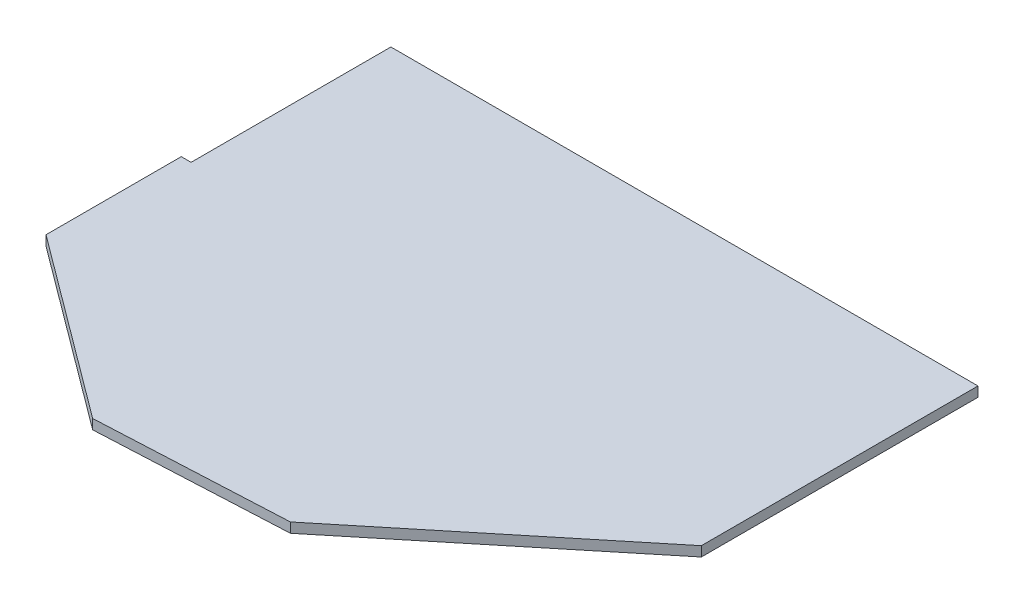
ISO-10303-21;
HEADER;
FILE_DESCRIPTION(('STEP AP214'),'2;1');
FILE_NAME('part.step','',(''),(''),'','','');
FILE_SCHEMA(('AUTOMOTIVE_DESIGN { 1 0 10303 214 1 1 1 1 }'));
ENDSEC;
DATA;
#1=APPLICATION_CONTEXT('core data for automotive mechanical design processes');
#2=APPLICATION_PROTOCOL_DEFINITION('international standard','automotive_design',2000,#1);
#3=PRODUCT_CONTEXT('',#1,'mechanical');
#4=PRODUCT('Part','Part','',(#3));
#5=PRODUCT_RELATED_PRODUCT_CATEGORY('part','',(#4));
#6=PRODUCT_DEFINITION_FORMATION('','',#4);
#7=PRODUCT_DEFINITION_CONTEXT('part definition',#1,'design');
#8=PRODUCT_DEFINITION('design','',#6,#7);
#9=PRODUCT_DEFINITION_SHAPE('','',#8);
#10=(LENGTH_UNIT() NAMED_UNIT(*) SI_UNIT(.MILLI.,.METRE.));
#11=(NAMED_UNIT(*) PLANE_ANGLE_UNIT() SI_UNIT($,.RADIAN.));
#12=(NAMED_UNIT(*) SI_UNIT($,.STERADIAN.) SOLID_ANGLE_UNIT());
#13=UNCERTAINTY_MEASURE_WITH_UNIT(LENGTH_MEASURE(1.E-05),#10,'distance_accuracy_value','');
#14=(GEOMETRIC_REPRESENTATION_CONTEXT(3) GLOBAL_UNCERTAINTY_ASSIGNED_CONTEXT((#13)) GLOBAL_UNIT_ASSIGNED_CONTEXT((#10,
#11,#12)) REPRESENTATION_CONTEXT('',''));
#15=CARTESIAN_POINT('',(0.,0.,0.));
#16=DIRECTION('',(0.,0.,1.));
#17=DIRECTION('',(1.,0.,0.));
#18=AXIS2_PLACEMENT_3D('',#15,#16,#17);
#19=CARTESIAN_POINT('',(-71.1992979722016,3.2,65.));
#20=DIRECTION('',(1.,0.,0.));
#21=DIRECTION('',(0.,0.,-1.));
#22=AXIS2_PLACEMENT_3D('',#19,#20,#21);
#23=PLANE('',#22);
#24=DIRECTION('',(0.,0.,1.));
#25=VECTOR('',#24,1.);
#26=CARTESIAN_POINT('',(-71.1992979722016,0.,65.));
#27=LINE('',#26,#25);
#28=CARTESIAN_POINT('',(-71.1992979722016,0.,0.));
#29=VERTEX_POINT('',#28);
#30=CARTESIAN_POINT('',(-71.1992979722016,0.,65.));
#31=VERTEX_POINT('',#30);
#32=EDGE_CURVE('E131',#29,#31,#27,.T.);
#33=ORIENTED_EDGE('',*,*,#32,.T.);
#34=DIRECTION('',(0.,-1.,0.));
#35=VECTOR('',#34,1.);
#36=CARTESIAN_POINT('',(-71.1992979722016,3.2,65.));
#37=LINE('',#36,#35);
#38=CARTESIAN_POINT('',(-71.1992979722016,3.2,65.));
#39=VERTEX_POINT('',#38);
#40=EDGE_CURVE('E36',#39,#31,#37,.T.);
#41=ORIENTED_EDGE('',*,*,#40,.F.);
#42=DIRECTION('',(0.,0.,1.));
#43=VECTOR('',#42,1.);
#44=CARTESIAN_POINT('',(-71.1992979722016,3.2,65.));
#45=LINE('',#44,#43);
#46=CARTESIAN_POINT('',(-71.1992979722016,3.2,0.));
#47=VERTEX_POINT('',#46);
#48=EDGE_CURVE('E146',#47,#39,#45,.T.);
#49=ORIENTED_EDGE('',*,*,#48,.F.);
#50=DIRECTION('',(0.,-1.,0.));
#51=VECTOR('',#50,1.);
#52=CARTESIAN_POINT('',(-71.1992979722016,3.2,0.));
#53=LINE('',#52,#51);
#54=EDGE_CURVE('E127',#47,#29,#53,.T.);
#55=ORIENTED_EDGE('',*,*,#54,.T.);
#56=EDGE_LOOP('',(#33,#41,#49,#55));
#57=FACE_BOUND('',#56,.T.);
#58=ADVANCED_FACE('F33',(#57),#23,.F.);
#59=CARTESIAN_POINT('',(-74.3992979722016,3.2,65.));
#60=DIRECTION('',(0.,0.,1.));
#61=DIRECTION('',(1.,0.,0.));
#62=AXIS2_PLACEMENT_3D('',#59,#60,#61);
#63=PLANE('',#62);
#64=DIRECTION('',(-1.,0.,0.));
#65=VECTOR('',#64,1.);
#66=CARTESIAN_POINT('',(-74.3992979722016,0.,65.));
#67=LINE('',#66,#65);
#68=CARTESIAN_POINT('',(-74.3992979722016,0.,65.));
#69=VERTEX_POINT('',#68);
#70=EDGE_CURVE('E134',#31,#69,#67,.T.);
#71=ORIENTED_EDGE('',*,*,#70,.T.);
#72=DIRECTION('',(0.,-1.,0.));
#73=VECTOR('',#72,1.);
#74=CARTESIAN_POINT('',(-74.3992979722016,3.2,65.));
#75=LINE('',#74,#73);
#76=CARTESIAN_POINT('',(-74.3992979722016,3.2,65.));
#77=VERTEX_POINT('',#76);
#78=EDGE_CURVE('E155',#77,#69,#75,.T.);
#79=ORIENTED_EDGE('',*,*,#78,.F.);
#80=DIRECTION('',(-1.,0.,0.));
#81=VECTOR('',#80,1.);
#82=CARTESIAN_POINT('',(-74.3992979722016,3.2,65.));
#83=LINE('',#82,#81);
#84=EDGE_CURVE('E94',#39,#77,#83,.T.);
#85=ORIENTED_EDGE('',*,*,#84,.F.);
#86=ORIENTED_EDGE('',*,*,#40,.T.);
#87=EDGE_LOOP('',(#71,#79,#85,#86));
#88=FACE_BOUND('',#87,.T.);
#89=ADVANCED_FACE('F161',(#88),#63,.F.);
#90=CARTESIAN_POINT('',(-74.3992979722016,3.2,109.));
#91=DIRECTION('',(1.,0.,0.));
#92=DIRECTION('',(0.,0.,-1.));
#93=AXIS2_PLACEMENT_3D('',#90,#91,#92);
#94=PLANE('',#93);
#95=DIRECTION('',(0.,0.,1.));
#96=VECTOR('',#95,1.);
#97=CARTESIAN_POINT('',(-74.3992979722016,0.,109.));
#98=LINE('',#97,#96);
#99=CARTESIAN_POINT('',(-74.3992979722016,0.,109.));
#100=VERTEX_POINT('',#99);
#101=EDGE_CURVE('E137',#69,#100,#98,.T.);
#102=ORIENTED_EDGE('',*,*,#101,.T.);
#103=DIRECTION('',(0.,-1.,0.));
#104=VECTOR('',#103,1.);
#105=CARTESIAN_POINT('',(-74.3992979722016,3.2,109.));
#106=LINE('',#105,#104);
#107=CARTESIAN_POINT('',(-74.3992979722016,3.2,109.));
#108=VERTEX_POINT('',#107);
#109=EDGE_CURVE('E153',#108,#100,#106,.T.);
#110=ORIENTED_EDGE('',*,*,#109,.F.);
#111=DIRECTION('',(0.,0.,1.));
#112=VECTOR('',#111,1.);
#113=CARTESIAN_POINT('',(-74.3992979722016,3.2,109.));
#114=LINE('',#113,#112);
#115=EDGE_CURVE('E176',#77,#108,#114,.T.);
#116=ORIENTED_EDGE('',*,*,#115,.F.);
#117=ORIENTED_EDGE('',*,*,#78,.T.);
#118=EDGE_LOOP('',(#102,#110,#116,#117));
#119=FACE_BOUND('',#118,.T.);
#120=ADVANCED_FACE('F170',(#119),#94,.F.);
#121=CARTESIAN_POINT('',(-15.0357311152875,3.2,153.181069815303));
#122=DIRECTION('',(0.597041483990583,0.,-0.802210362931271));
#123=DIRECTION('',(-0.802210362931272,0.,-0.597041483990583));
#124=AXIS2_PLACEMENT_3D('',#121,#122,#123);
#125=PLANE('',#124);
#126=DIRECTION('',(0.802210362931271,0.,0.597041483990583));
#127=VECTOR('',#126,1.);
#128=CARTESIAN_POINT('',(-15.0357311152875,0.,153.181069815303));
#129=LINE('',#128,#127);
#130=CARTESIAN_POINT('',(-15.0357311152875,0.,153.181069815303));
#131=VERTEX_POINT('',#130);
#132=EDGE_CURVE('E139',#100,#131,#129,.T.);
#133=ORIENTED_EDGE('',*,*,#132,.T.);
#134=DIRECTION('',(0.,-1.,0.));
#135=VECTOR('',#134,1.);
#136=CARTESIAN_POINT('',(-15.0357311152875,3.2,153.181069815303));
#137=LINE('',#136,#135);
#138=CARTESIAN_POINT('',(-15.0357311152875,3.2,153.181069815303));
#139=VERTEX_POINT('',#138);
#140=EDGE_CURVE('E150',#139,#131,#137,.T.);
#141=ORIENTED_EDGE('',*,*,#140,.F.);
#142=DIRECTION('',(0.802210362931271,0.,0.597041483990583));
#143=VECTOR('',#142,1.);
#144=CARTESIAN_POINT('',(-15.0357311152875,3.2,153.181069815303));
#145=LINE('',#144,#143);
#146=EDGE_CURVE('E175',#108,#139,#145,.T.);
#147=ORIENTED_EDGE('',*,*,#146,.F.);
#148=ORIENTED_EDGE('',*,*,#109,.T.);
#149=EDGE_LOOP('',(#133,#141,#147,#148));
#150=FACE_BOUND('',#149,.T.);
#151=ADVANCED_FACE('F173',(#150),#125,.F.);
#152=CARTESIAN_POINT('',(46.2729248544923,3.2,150.155348755972));
#153=DIRECTION('',(-0.0492922726193887,0.,-0.998784397084784));
#154=DIRECTION('',(-0.998784397084784,0.,0.0492922726193887));
#155=AXIS2_PLACEMENT_3D('',#152,#153,#154);
#156=PLANE('',#155);
#157=DIRECTION('',(0.998784397084784,0.,-0.0492922726193887));
#158=VECTOR('',#157,1.);
#159=CARTESIAN_POINT('',(46.2729248544923,0.,150.155348755972));
#160=LINE('',#159,#158);
#161=CARTESIAN_POINT('',(46.2729248544923,0.,150.155348755972));
#162=VERTEX_POINT('',#161);
#163=EDGE_CURVE('E141',#131,#162,#160,.T.);
#164=ORIENTED_EDGE('',*,*,#163,.T.);
#165=DIRECTION('',(0.,-1.,0.));
#166=VECTOR('',#165,1.);
#167=CARTESIAN_POINT('',(46.2729248544923,3.2,150.155348755972));
#168=LINE('',#167,#166);
#169=CARTESIAN_POINT('',(46.2729248544923,3.2,150.155348755972));
#170=VERTEX_POINT('',#169);
#171=EDGE_CURVE('E122',#170,#162,#168,.T.);
#172=ORIENTED_EDGE('',*,*,#171,.F.);
#173=DIRECTION('',(0.998784397084784,0.,-0.0492922726193887));
#174=VECTOR('',#173,1.);
#175=CARTESIAN_POINT('',(46.2729248544923,3.2,150.155348755972));
#176=LINE('',#175,#174);
#177=EDGE_CURVE('E113',#139,#170,#176,.T.);
#178=ORIENTED_EDGE('',*,*,#177,.F.);
#179=ORIENTED_EDGE('',*,*,#140,.T.);
#180=EDGE_LOOP('',(#164,#172,#178,#179));
#181=FACE_BOUND('',#180,.T.);
#182=ADVANCED_FACE('F230',(#181),#156,.F.);
#183=CARTESIAN_POINT('',(119.800702027798,3.2,90.));
#184=DIRECTION('',(-0.633214197431285,0.,-0.773976601824276));
#185=DIRECTION('',(-0.773976601824276,0.,0.633214197431285));
#186=AXIS2_PLACEMENT_3D('',#183,#184,#185);
#187=PLANE('',#186);
#188=DIRECTION('',(0.773976601824276,0.,-0.633214197431285));
#189=VECTOR('',#188,1.);
#190=CARTESIAN_POINT('',(119.800702027798,0.,90.));
#191=LINE('',#190,#189);
#192=CARTESIAN_POINT('',(119.800702027798,0.,90.));
#193=VERTEX_POINT('',#192);
#194=EDGE_CURVE('E121',#162,#193,#191,.T.);
#195=ORIENTED_EDGE('',*,*,#194,.T.);
#196=DIRECTION('',(0.,-1.,0.));
#197=VECTOR('',#196,1.);
#198=CARTESIAN_POINT('',(119.800702027798,3.2,90.));
#199=LINE('',#198,#197);
#200=CARTESIAN_POINT('',(119.800702027798,3.2,90.));
#201=VERTEX_POINT('',#200);
#202=EDGE_CURVE('E118',#201,#193,#199,.T.);
#203=ORIENTED_EDGE('',*,*,#202,.F.);
#204=DIRECTION('',(0.773976601824276,0.,-0.633214197431285));
#205=VECTOR('',#204,1.);
#206=CARTESIAN_POINT('',(119.800702027798,3.2,90.));
#207=LINE('',#206,#205);
#208=EDGE_CURVE('E107',#170,#201,#207,.T.);
#209=ORIENTED_EDGE('',*,*,#208,.F.);
#210=ORIENTED_EDGE('',*,*,#171,.T.);
#211=EDGE_LOOP('',(#195,#203,#209,#210));
#212=FACE_BOUND('',#211,.T.);
#213=ADVANCED_FACE('F119',(#212),#187,.F.);
#214=CARTESIAN_POINT('',(119.800702027798,3.2,0.));
#215=DIRECTION('',(-1.,0.,0.));
#216=DIRECTION('',(0.,0.,1.));
#217=AXIS2_PLACEMENT_3D('',#214,#215,#216);
#218=PLANE('',#217);
#219=DIRECTION('',(0.,0.,-1.));
#220=VECTOR('',#219,1.);
#221=CARTESIAN_POINT('',(119.800702027798,0.,0.));
#222=LINE('',#221,#220);
#223=CARTESIAN_POINT('',(119.800702027798,0.,0.));
#224=VERTEX_POINT('',#223);
#225=EDGE_CURVE('E79',#193,#224,#222,.T.);
#226=ORIENTED_EDGE('',*,*,#225,.T.);
#227=DIRECTION('',(0.,-1.,0.));
#228=VECTOR('',#227,1.);
#229=CARTESIAN_POINT('',(119.800702027798,3.2,0.));
#230=LINE('',#229,#228);
#231=CARTESIAN_POINT('',(119.800702027798,3.2,0.));
#232=VERTEX_POINT('',#231);
#233=EDGE_CURVE('E123',#232,#224,#230,.T.);
#234=ORIENTED_EDGE('',*,*,#233,.F.);
#235=DIRECTION('',(0.,0.,-1.));
#236=VECTOR('',#235,1.);
#237=CARTESIAN_POINT('',(119.800702027798,3.2,0.));
#238=LINE('',#237,#236);
#239=EDGE_CURVE('E111',#201,#232,#238,.T.);
#240=ORIENTED_EDGE('',*,*,#239,.F.);
#241=ORIENTED_EDGE('',*,*,#202,.T.);
#242=EDGE_LOOP('',(#226,#234,#240,#241));
#243=FACE_BOUND('',#242,.T.);
#244=ADVANCED_FACE('F125',(#243),#218,.F.);
#245=CARTESIAN_POINT('',(-71.1992979722016,3.2,0.));
#246=DIRECTION('',(0.,0.,1.));
#247=DIRECTION('',(1.,0.,0.));
#248=AXIS2_PLACEMENT_3D('',#245,#246,#247);
#249=PLANE('',#248);
#250=DIRECTION('',(-1.,0.,0.));
#251=VECTOR('',#250,1.);
#252=CARTESIAN_POINT('',(-71.1992979722016,0.,0.));
#253=LINE('',#252,#251);
#254=EDGE_CURVE('E85',#224,#29,#253,.T.);
#255=ORIENTED_EDGE('',*,*,#254,.T.);
#256=ORIENTED_EDGE('',*,*,#54,.F.);
#257=DIRECTION('',(-1.,0.,0.));
#258=VECTOR('',#257,1.);
#259=CARTESIAN_POINT('',(-71.1992979722016,3.2,0.));
#260=LINE('',#259,#258);
#261=EDGE_CURVE('E50',#232,#47,#260,.T.);
#262=ORIENTED_EDGE('',*,*,#261,.F.);
#263=ORIENTED_EDGE('',*,*,#233,.T.);
#264=EDGE_LOOP('',(#255,#256,#262,#263));
#265=FACE_BOUND('',#264,.T.);
#266=ADVANCED_FACE('F216',(#265),#249,.F.);
#267=CARTESIAN_POINT('',(0.,3.2,0.));
#268=DIRECTION('',(0.,-1.,0.));
#269=DIRECTION('',(0.,0.,-1.));
#270=AXIS2_PLACEMENT_3D('',#267,#268,#269);
#271=PLANE('',#270);
#272=ORIENTED_EDGE('',*,*,#48,.T.);
#273=ORIENTED_EDGE('',*,*,#84,.T.);
#274=ORIENTED_EDGE('',*,*,#115,.T.);
#275=ORIENTED_EDGE('',*,*,#146,.T.);
#276=ORIENTED_EDGE('',*,*,#177,.T.);
#277=ORIENTED_EDGE('',*,*,#208,.T.);
#278=ORIENTED_EDGE('',*,*,#239,.T.);
#279=ORIENTED_EDGE('',*,*,#261,.T.);
#280=EDGE_LOOP('',(#272,#273,#274,#275,#276,#277,#278,#279));
#281=FACE_BOUND('',#280,.T.);
#282=ADVANCED_FACE('F109',(#281),#271,.F.);
#283=CARTESIAN_POINT('',(0.,0.,0.));
#284=DIRECTION('',(0.,-1.,0.));
#285=DIRECTION('',(0.,0.,-1.));
#286=AXIS2_PLACEMENT_3D('',#283,#284,#285);
#287=PLANE('',#286);
#288=CARTESIAN_POINT('',(-5.39929797220156,0.,108.199281836625));
#289=DIRECTION('',(0.,-1.,0.));
#290=DIRECTION('',(0.,0.,-1.));
#291=AXIS2_PLACEMENT_3D('',#288,#289,#290);
#292=CIRCLE('',#291,12.3);
#293=CARTESIAN_POINT('',(-5.39929797220156,0.,95.8992818366245));
#294=VERTEX_POINT('',#293);
#295=EDGE_CURVE('E182',#294,#294,#292,.T.);
#296=ORIENTED_EDGE('',*,*,#295,.F.);
#297=EDGE_LOOP('',(#296));
#298=FACE_BOUND('',#297,.T.);
#299=ORIENTED_EDGE('',*,*,#32,.F.);
#300=ORIENTED_EDGE('',*,*,#254,.F.);
#301=ORIENTED_EDGE('',*,*,#225,.F.);
#302=ORIENTED_EDGE('',*,*,#194,.F.);
#303=ORIENTED_EDGE('',*,*,#163,.F.);
#304=ORIENTED_EDGE('',*,*,#132,.F.);
#305=ORIENTED_EDGE('',*,*,#101,.F.);
#306=ORIENTED_EDGE('',*,*,#70,.F.);
#307=EDGE_LOOP('',(#299,#300,#301,#302,#303,#304,#305,#306));
#308=FACE_BOUND('',#307,.T.);
#309=ADVANCED_FACE('F166',(#298,#308),#287,.T.);
#310=CARTESIAN_POINT('',(-5.39929797220156,-3.2,108.199281836625));
#311=DIRECTION('',(0.,1.,0.));
#312=DIRECTION('',(0.,0.,1.));
#313=AXIS2_PLACEMENT_3D('',#310,#311,#312);
#314=CYLINDRICAL_SURFACE('',#313,12.3);
#315=CARTESIAN_POINT('',(-5.39929797220156,-3.2,108.199281836625));
#316=DIRECTION('',(0.,-1.,0.));
#317=DIRECTION('',(0.,0.,-1.));
#318=AXIS2_PLACEMENT_3D('',#315,#316,#317);
#319=CIRCLE('',#318,12.3);
#320=CARTESIAN_POINT('',(-5.39929797220156,-3.2,95.8992818366245));
#321=VERTEX_POINT('',#320);
#322=EDGE_CURVE('E135',#321,#321,#319,.T.);
#323=ORIENTED_EDGE('',*,*,#322,.F.);
#324=EDGE_LOOP('',(#323));
#325=FACE_BOUND('',#324,.T.);
#326=ORIENTED_EDGE('',*,*,#295,.T.);
#327=EDGE_LOOP('',(#326));
#328=FACE_BOUND('',#327,.T.);
#329=ADVANCED_FACE('F202',(#325,#328),#314,.T.);
#330=CARTESIAN_POINT('',(-5.39929797220156,-3.2,108.199281836625));
#331=DIRECTION('',(0.,-1.,0.));
#332=DIRECTION('',(0.,0.,-1.));
#333=AXIS2_PLACEMENT_3D('',#330,#331,#332);
#334=PLANE('',#333);
#335=CARTESIAN_POINT('',(-5.39929797220156,-3.2,108.199281836625));
#336=DIRECTION('',(0.,-1.,0.));
#337=DIRECTION('',(0.,0.,-1.));
#338=AXIS2_PLACEMENT_3D('',#335,#336,#337);
#339=CIRCLE('',#338,4.);
#340=CARTESIAN_POINT('',(-5.39929797220156,-3.2,104.199281836625));
#341=VERTEX_POINT('',#340);
#342=EDGE_CURVE('E11',#341,#341,#339,.T.);
#343=ORIENTED_EDGE('',*,*,#342,.F.);
#344=EDGE_LOOP('',(#343));
#345=FACE_BOUND('',#344,.T.);
#346=ORIENTED_EDGE('',*,*,#322,.T.);
#347=EDGE_LOOP('',(#346));
#348=FACE_BOUND('',#347,.T.);
#349=ADVANCED_FACE('F196',(#345,#348),#334,.T.);
#350=CARTESIAN_POINT('',(-5.39929797220156,-7.2,108.199281836625));
#351=DIRECTION('',(0.,1.,0.));
#352=DIRECTION('',(0.,0.,1.));
#353=AXIS2_PLACEMENT_3D('',#350,#351,#352);
#354=CYLINDRICAL_SURFACE('',#353,4.);
#355=CARTESIAN_POINT('',(-5.39929797220156,-7.2,108.199281836625));
#356=DIRECTION('',(0.,-1.,0.));
#357=DIRECTION('',(0.,0.,-1.));
#358=AXIS2_PLACEMENT_3D('',#355,#356,#357);
#359=CIRCLE('',#358,4.);
#360=CARTESIAN_POINT('',(-5.39929797220156,-7.2,104.199281836625));
#361=VERTEX_POINT('',#360);
#362=EDGE_CURVE('E185',#361,#361,#359,.T.);
#363=ORIENTED_EDGE('',*,*,#362,.F.);
#364=EDGE_LOOP('',(#363));
#365=FACE_BOUND('',#364,.T.);
#366=ORIENTED_EDGE('',*,*,#342,.T.);
#367=EDGE_LOOP('',(#366));
#368=FACE_BOUND('',#367,.T.);
#369=ADVANCED_FACE('F193',(#365,#368),#354,.T.);
#370=CARTESIAN_POINT('',(-5.39929797220156,-7.2,108.199281836625));
#371=DIRECTION('',(0.,-1.,0.));
#372=DIRECTION('',(0.,0.,-1.));
#373=AXIS2_PLACEMENT_3D('',#370,#371,#372);
#374=PLANE('',#373);
#375=ORIENTED_EDGE('',*,*,#362,.T.);
#376=EDGE_LOOP('',(#375));
#377=FACE_BOUND('',#376,.T.);
#378=ADVANCED_FACE('F191',(#377),#374,.T.);
#379=CLOSED_SHELL('',(#58,#89,#120,#151,#182,#213,#244,#266,#282,#309,#329,#349,#369,#378));
#380=MANIFOLD_SOLID_BREP('B2',#379);
#381=ADVANCED_BREP_SHAPE_REPRESENTATION('',(#18,#380),#14);
#382=SHAPE_DEFINITION_REPRESENTATION(#9,#381);
ENDSEC;
END-ISO-10303-21;
